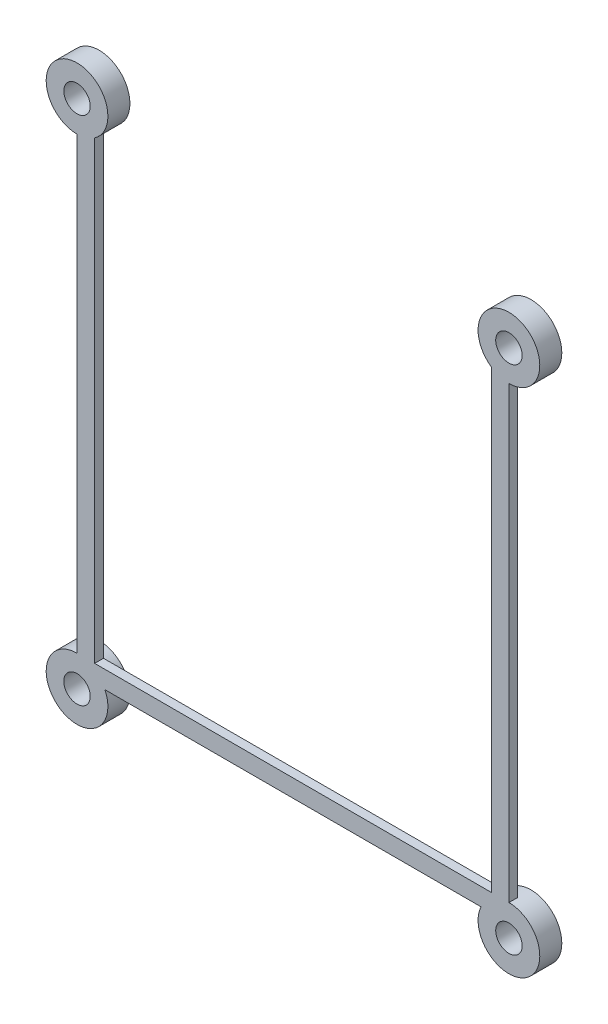
ISO-10303-21;
HEADER;
FILE_DESCRIPTION(('STEP AP214'),'2;1');
FILE_NAME('part.step','',(''),(''),'','','');
FILE_SCHEMA(('AUTOMOTIVE_DESIGN { 1 0 10303 214 1 1 1 1 }'));
ENDSEC;
DATA;
#1=APPLICATION_CONTEXT('core data for automotive mechanical design processes');
#2=APPLICATION_PROTOCOL_DEFINITION('international standard','automotive_design',2000,#1);
#3=PRODUCT_CONTEXT('',#1,'mechanical');
#4=PRODUCT('Part','Part','',(#3));
#5=PRODUCT_RELATED_PRODUCT_CATEGORY('part','',(#4));
#6=PRODUCT_DEFINITION_FORMATION('','',#4);
#7=PRODUCT_DEFINITION_CONTEXT('part definition',#1,'design');
#8=PRODUCT_DEFINITION('design','',#6,#7);
#9=PRODUCT_DEFINITION_SHAPE('','',#8);
#10=(LENGTH_UNIT() NAMED_UNIT(*) SI_UNIT(.MILLI.,.METRE.));
#11=(NAMED_UNIT(*) PLANE_ANGLE_UNIT() SI_UNIT($,.RADIAN.));
#12=(NAMED_UNIT(*) SI_UNIT($,.STERADIAN.) SOLID_ANGLE_UNIT());
#13=UNCERTAINTY_MEASURE_WITH_UNIT(LENGTH_MEASURE(1.E-05),#10,'distance_accuracy_value','');
#14=(GEOMETRIC_REPRESENTATION_CONTEXT(3) GLOBAL_UNCERTAINTY_ASSIGNED_CONTEXT((#13)) GLOBAL_UNIT_ASSIGNED_CONTEXT((#10,
#11,#12)) REPRESENTATION_CONTEXT('',''));
#15=CARTESIAN_POINT('',(0.,0.,0.));
#16=DIRECTION('',(0.,0.,1.));
#17=DIRECTION('',(1.,0.,0.));
#18=AXIS2_PLACEMENT_3D('',#15,#16,#17);
#19=CARTESIAN_POINT('',(-24.5,-27.5,1.5));
#20=DIRECTION('',(0.,-1.,0.));
#21=DIRECTION('',(1.,0.,0.));
#22=AXIS2_PLACEMENT_3D('',#19,#20,#21);
#23=PLANE('',#22);
#24=DIRECTION('',(1.,0.,0.));
#25=VECTOR('',#24,1.);
#26=CARTESIAN_POINT('',(-24.5,-27.5,1.5));
#27=LINE('',#26,#25);
#28=CARTESIAN_POINT('',(-21.3377223398316,-27.5,1.5));
#29=VERTEX_POINT('',#28);
#30=CARTESIAN_POINT('',(21.3377223398316,-27.5,1.5));
#31=VERTEX_POINT('',#30);
#32=EDGE_CURVE('E123',#29,#31,#27,.T.);
#33=ORIENTED_EDGE('',*,*,#32,.T.);
#34=DIRECTION('',(0.,0.,-1.));
#35=VECTOR('',#34,1.);
#36=CARTESIAN_POINT('',(21.3377223398316,-27.5,2.5));
#37=LINE('',#36,#35);
#38=CARTESIAN_POINT('',(21.3377223398316,-27.5,2.5));
#39=VERTEX_POINT('',#38);
#40=EDGE_CURVE('E62',#31,#39,#37,.F.);
#41=ORIENTED_EDGE('',*,*,#40,.T.);
#42=DIRECTION('',(1.,0.,0.));
#43=VECTOR('',#42,1.);
#44=CARTESIAN_POINT('',(-24.5,-27.5,2.5));
#45=LINE('',#44,#43);
#46=CARTESIAN_POINT('',(-21.3377223398316,-27.5,2.5));
#47=VERTEX_POINT('',#46);
#48=EDGE_CURVE('E188',#47,#39,#45,.T.);
#49=ORIENTED_EDGE('',*,*,#48,.F.);
#50=DIRECTION('',(0.,0.,-1.));
#51=VECTOR('',#50,1.);
#52=CARTESIAN_POINT('',(-21.3377223398316,-27.5,2.5));
#53=LINE('',#52,#51);
#54=EDGE_CURVE('E148',#47,#29,#53,.T.);
#55=ORIENTED_EDGE('',*,*,#54,.T.);
#56=EDGE_LOOP('',(#33,#41,#49,#55));
#57=FACE_BOUND('',#56,.T.);
#58=ADVANCED_FACE('F39',(#57),#23,.T.);
#59=CARTESIAN_POINT('',(24.5,27.5,1.5));
#60=DIRECTION('',(1.,0.,0.));
#61=DIRECTION('',(0.,1.,0.));
#62=AXIS2_PLACEMENT_3D('',#59,#60,#61);
#63=PLANE('',#62);
#64=DIRECTION('',(0.,1.,0.));
#65=VECTOR('',#64,1.);
#66=CARTESIAN_POINT('',(24.5,27.5,2.5));
#67=LINE('',#66,#65);
#68=CARTESIAN_POINT('',(24.5,-25.5,2.5));
#69=VERTEX_POINT('',#68);
#70=CARTESIAN_POINT('',(24.5,25.5,2.5));
#71=VERTEX_POINT('',#70);
#72=EDGE_CURVE('E54',#69,#71,#67,.T.);
#73=ORIENTED_EDGE('',*,*,#72,.F.);
#74=DIRECTION('',(0.,0.,-1.));
#75=VECTOR('',#74,1.);
#76=CARTESIAN_POINT('',(24.5,-25.5,2.5));
#77=LINE('',#76,#75);
#78=CARTESIAN_POINT('',(24.5,-25.5,1.5));
#79=VERTEX_POINT('',#78);
#80=EDGE_CURVE('E125',#69,#79,#77,.T.);
#81=ORIENTED_EDGE('',*,*,#80,.T.);
#82=DIRECTION('',(0.,1.,0.));
#83=VECTOR('',#82,1.);
#84=CARTESIAN_POINT('',(24.5,27.5,1.5));
#85=LINE('',#84,#83);
#86=CARTESIAN_POINT('',(24.5,25.5,1.5));
#87=VERTEX_POINT('',#86);
#88=EDGE_CURVE('E117',#79,#87,#85,.T.);
#89=ORIENTED_EDGE('',*,*,#88,.T.);
#90=DIRECTION('',(0.,0.,-1.));
#91=VECTOR('',#90,1.);
#92=CARTESIAN_POINT('',(24.5,25.5,2.5));
#93=LINE('',#92,#91);
#94=EDGE_CURVE('E165',#87,#71,#93,.F.);
#95=ORIENTED_EDGE('',*,*,#94,.T.);
#96=EDGE_LOOP('',(#73,#81,#89,#95));
#97=FACE_BOUND('',#96,.T.);
#98=ADVANCED_FACE('F126',(#97),#63,.T.);
#99=CARTESIAN_POINT('',(-24.5,-27.5,1.5));
#100=DIRECTION('',(-1.,0.,0.));
#101=DIRECTION('',(0.,-1.,0.));
#102=AXIS2_PLACEMENT_3D('',#99,#100,#101);
#103=PLANE('',#102);
#104=DIRECTION('',(0.,-1.,0.));
#105=VECTOR('',#104,1.);
#106=CARTESIAN_POINT('',(-24.5,-27.5,1.5));
#107=LINE('',#106,#105);
#108=CARTESIAN_POINT('',(-24.5,25.5,1.5));
#109=VERTEX_POINT('',#108);
#110=CARTESIAN_POINT('',(-24.5,-25.5,1.5));
#111=VERTEX_POINT('',#110);
#112=EDGE_CURVE('E173',#109,#111,#107,.T.);
#113=ORIENTED_EDGE('',*,*,#112,.T.);
#114=DIRECTION('',(0.,0.,-1.));
#115=VECTOR('',#114,1.);
#116=CARTESIAN_POINT('',(-24.5,-25.5,2.5));
#117=LINE('',#116,#115);
#118=CARTESIAN_POINT('',(-24.5,-25.5,2.5));
#119=VERTEX_POINT('',#118);
#120=EDGE_CURVE('E153',#111,#119,#117,.F.);
#121=ORIENTED_EDGE('',*,*,#120,.T.);
#122=DIRECTION('',(0.,-1.,0.));
#123=VECTOR('',#122,1.);
#124=CARTESIAN_POINT('',(-24.5,-27.5,2.5));
#125=LINE('',#124,#123);
#126=CARTESIAN_POINT('',(-24.5,25.5,2.5));
#127=VERTEX_POINT('',#126);
#128=EDGE_CURVE('E172',#127,#119,#125,.T.);
#129=ORIENTED_EDGE('',*,*,#128,.F.);
#130=DIRECTION('',(0.,0.,-1.));
#131=VECTOR('',#130,1.);
#132=CARTESIAN_POINT('',(-24.5,25.5,2.5));
#133=LINE('',#132,#131);
#134=EDGE_CURVE('E203',#109,#127,#133,.F.);
#135=ORIENTED_EDGE('',*,*,#134,.F.);
#136=EDGE_LOOP('',(#113,#121,#129,#135));
#137=FACE_BOUND('',#136,.T.);
#138=ADVANCED_FACE('F231',(#137),#103,.T.);
#139=CARTESIAN_POINT('',(22.5,27.5,1.5));
#140=DIRECTION('',(-1.,0.,0.));
#141=DIRECTION('',(0.,-1.,0.));
#142=AXIS2_PLACEMENT_3D('',#139,#140,#141);
#143=PLANE('',#142);
#144=DIRECTION('',(0.,-1.,0.));
#145=VECTOR('',#144,1.);
#146=CARTESIAN_POINT('',(22.5,27.5,2.5));
#147=LINE('',#146,#145);
#148=CARTESIAN_POINT('',(22.5,26.127718676731,2.5));
#149=VERTEX_POINT('',#148);
#150=CARTESIAN_POINT('',(22.5,-25.5,2.5));
#151=VERTEX_POINT('',#150);
#152=EDGE_CURVE('E191',#149,#151,#147,.T.);
#153=ORIENTED_EDGE('',*,*,#152,.F.);
#154=DIRECTION('',(0.,0.,-1.));
#155=VECTOR('',#154,1.);
#156=CARTESIAN_POINT('',(22.5,26.127718676731,2.5));
#157=LINE('',#156,#155);
#158=CARTESIAN_POINT('',(22.5,26.127718676731,1.5));
#159=VERTEX_POINT('',#158);
#160=EDGE_CURVE('E169',#149,#159,#157,.T.);
#161=ORIENTED_EDGE('',*,*,#160,.T.);
#162=DIRECTION('',(0.,-1.,0.));
#163=VECTOR('',#162,1.);
#164=CARTESIAN_POINT('',(22.5,27.5,1.5));
#165=LINE('',#164,#163);
#166=CARTESIAN_POINT('',(22.5,-25.5,1.5));
#167=VERTEX_POINT('',#166);
#168=EDGE_CURVE('E122',#159,#167,#165,.T.);
#169=ORIENTED_EDGE('',*,*,#168,.T.);
#170=DIRECTION('',(0.,0.,1.));
#171=VECTOR('',#170,1.);
#172=CARTESIAN_POINT('',(22.5,-25.5,1.5));
#173=LINE('',#172,#171);
#174=EDGE_CURVE('E185',#167,#151,#173,.T.);
#175=ORIENTED_EDGE('',*,*,#174,.T.);
#176=EDGE_LOOP('',(#153,#161,#169,#175));
#177=FACE_BOUND('',#176,.T.);
#178=ADVANCED_FACE('F249',(#177),#143,.T.);
#179=CARTESIAN_POINT('',(-24.5,29.,2.5));
#180=DIRECTION('',(0.,0.,1.));
#181=DIRECTION('',(1.,0.,0.));
#182=AXIS2_PLACEMENT_3D('',#179,#180,#181);
#183=PLANE('',#182);
#184=CARTESIAN_POINT('',(24.5,-29.,2.5));
#185=DIRECTION('',(0.,0.,1.));
#186=DIRECTION('',(1.,0.,0.));
#187=AXIS2_PLACEMENT_3D('',#184,#185,#186);
#188=CIRCLE('',#187,1.49999999999998);
#189=CARTESIAN_POINT('',(26.,-29.,2.5));
#190=VERTEX_POINT('',#189);
#191=EDGE_CURVE('E258',#190,#190,#188,.T.);
#192=ORIENTED_EDGE('',*,*,#191,.F.);
#193=EDGE_LOOP('',(#192));
#194=FACE_BOUND('',#193,.T.);
#195=CARTESIAN_POINT('',(-24.5,29.,2.5));
#196=DIRECTION('',(0.,0.,1.));
#197=DIRECTION('',(1.,0.,0.));
#198=AXIS2_PLACEMENT_3D('',#195,#196,#197);
#199=CIRCLE('',#198,1.5);
#200=CARTESIAN_POINT('',(-23.,29.,2.5));
#201=VERTEX_POINT('',#200);
#202=EDGE_CURVE('E207',#201,#201,#199,.T.);
#203=ORIENTED_EDGE('',*,*,#202,.F.);
#204=EDGE_LOOP('',(#203));
#205=FACE_BOUND('',#204,.T.);
#206=ORIENTED_EDGE('',*,*,#48,.T.);
#207=CARTESIAN_POINT('',(24.5,-29.,2.5));
#208=DIRECTION('',(0.,0.,1.));
#209=DIRECTION('',(1.,0.,0.));
#210=AXIS2_PLACEMENT_3D('',#207,#208,#209);
#211=CIRCLE('',#210,3.5);
#212=EDGE_CURVE('E134',#39,#69,#211,.T.);
#213=ORIENTED_EDGE('',*,*,#212,.T.);
#214=ORIENTED_EDGE('',*,*,#72,.T.);
#215=CARTESIAN_POINT('',(24.5,29.,2.5));
#216=DIRECTION('',(0.,0.,1.));
#217=DIRECTION('',(1.,0.,0.));
#218=AXIS2_PLACEMENT_3D('',#215,#216,#217);
#219=CIRCLE('',#218,3.5);
#220=EDGE_CURVE('E155',#71,#149,#219,.T.);
#221=ORIENTED_EDGE('',*,*,#220,.T.);
#222=ORIENTED_EDGE('',*,*,#152,.T.);
#223=DIRECTION('',(-1.,0.,0.));
#224=VECTOR('',#223,1.);
#225=CARTESIAN_POINT('',(22.5,-25.5,2.5));
#226=LINE('',#225,#224);
#227=CARTESIAN_POINT('',(-22.5,-25.5,2.5));
#228=VERTEX_POINT('',#227);
#229=EDGE_CURVE('E193',#151,#228,#226,.T.);
#230=ORIENTED_EDGE('',*,*,#229,.T.);
#231=DIRECTION('',(0.,1.,0.));
#232=VECTOR('',#231,1.);
#233=CARTESIAN_POINT('',(-22.5,-25.5,2.5));
#234=LINE('',#233,#232);
#235=CARTESIAN_POINT('',(-22.5,26.127718676731,2.5));
#236=VERTEX_POINT('',#235);
#237=EDGE_CURVE('E176',#228,#236,#234,.T.);
#238=ORIENTED_EDGE('',*,*,#237,.T.);
#239=CARTESIAN_POINT('',(-24.5,29.,2.5));
#240=DIRECTION('',(0.,0.,1.));
#241=DIRECTION('',(1.,0.,0.));
#242=AXIS2_PLACEMENT_3D('',#239,#240,#241);
#243=CIRCLE('',#242,3.5);
#244=EDGE_CURVE('E213',#236,#127,#243,.T.);
#245=ORIENTED_EDGE('',*,*,#244,.T.);
#246=ORIENTED_EDGE('',*,*,#128,.T.);
#247=CARTESIAN_POINT('',(-24.5,-29.,2.5));
#248=DIRECTION('',(0.,0.,1.));
#249=DIRECTION('',(1.,0.,0.));
#250=AXIS2_PLACEMENT_3D('',#247,#248,#249);
#251=CIRCLE('',#250,3.5);
#252=EDGE_CURVE('E135',#119,#47,#251,.T.);
#253=ORIENTED_EDGE('',*,*,#252,.T.);
#254=EDGE_LOOP('',(#206,#213,#214,#221,#222,#230,#238,#245,#246,#253));
#255=FACE_BOUND('',#254,.T.);
#256=CARTESIAN_POINT('',(24.5,29.,2.5));
#257=DIRECTION('',(0.,0.,1.));
#258=DIRECTION('',(1.,0.,0.));
#259=AXIS2_PLACEMENT_3D('',#256,#257,#258);
#260=CIRCLE('',#259,1.49999999999999);
#261=CARTESIAN_POINT('',(26.,29.,2.5));
#262=VERTEX_POINT('',#261);
#263=EDGE_CURVE('E159',#262,#262,#260,.T.);
#264=ORIENTED_EDGE('',*,*,#263,.F.);
#265=EDGE_LOOP('',(#264));
#266=FACE_BOUND('',#265,.T.);
#267=CARTESIAN_POINT('',(-24.5,-29.,2.5));
#268=DIRECTION('',(0.,0.,1.));
#269=DIRECTION('',(1.,0.,0.));
#270=AXIS2_PLACEMENT_3D('',#267,#268,#269);
#271=CIRCLE('',#270,1.5);
#272=CARTESIAN_POINT('',(-23.,-29.,2.5));
#273=VERTEX_POINT('',#272);
#274=EDGE_CURVE('E143',#273,#273,#271,.T.);
#275=ORIENTED_EDGE('',*,*,#274,.F.);
#276=EDGE_LOOP('',(#275));
#277=FACE_BOUND('',#276,.T.);
#278=ADVANCED_FACE('F236',(#194,#205,#255,#266,#277),#183,.T.);
#279=CARTESIAN_POINT('',(-24.5,29.,0.));
#280=DIRECTION('',(0.,0.,1.));
#281=DIRECTION('',(1.,0.,0.));
#282=AXIS2_PLACEMENT_3D('',#279,#280,#281);
#283=PLANE('',#282);
#284=CARTESIAN_POINT('',(-24.5,29.,0.));
#285=DIRECTION('',(0.,0.,1.));
#286=DIRECTION('',(1.,0.,0.));
#287=AXIS2_PLACEMENT_3D('',#284,#285,#286);
#288=CIRCLE('',#287,3.5);
#289=CARTESIAN_POINT('',(-21.,29.,0.));
#290=VERTEX_POINT('',#289);
#291=EDGE_CURVE('E210',#290,#290,#288,.T.);
#292=ORIENTED_EDGE('',*,*,#291,.F.);
#293=EDGE_LOOP('',(#292));
#294=FACE_BOUND('',#293,.T.);
#295=CARTESIAN_POINT('',(-24.5,29.,0.));
#296=DIRECTION('',(0.,0.,1.));
#297=DIRECTION('',(1.,0.,0.));
#298=AXIS2_PLACEMENT_3D('',#295,#296,#297);
#299=CIRCLE('',#298,1.5);
#300=CARTESIAN_POINT('',(-23.,29.,0.));
#301=VERTEX_POINT('',#300);
#302=EDGE_CURVE('E206',#301,#301,#299,.T.);
#303=ORIENTED_EDGE('',*,*,#302,.T.);
#304=EDGE_LOOP('',(#303));
#305=FACE_BOUND('',#304,.T.);
#306=ADVANCED_FACE('F270',(#294,#305),#283,.F.);
#307=CARTESIAN_POINT('',(-24.5,29.,2.5));
#308=DIRECTION('',(0.,0.,-1.));
#309=DIRECTION('',(-1.,0.,0.));
#310=AXIS2_PLACEMENT_3D('',#307,#308,#309);
#311=CYLINDRICAL_SURFACE('',#310,3.5);
#312=ORIENTED_EDGE('',*,*,#244,.F.);
#313=DIRECTION('',(0.,0.,-1.));
#314=VECTOR('',#313,1.);
#315=CARTESIAN_POINT('',(-22.5,26.127718676731,2.5));
#316=LINE('',#315,#314);
#317=CARTESIAN_POINT('',(-22.5,26.127718676731,1.5));
#318=VERTEX_POINT('',#317);
#319=EDGE_CURVE('E216',#236,#318,#316,.T.);
#320=ORIENTED_EDGE('',*,*,#319,.T.);
#321=CARTESIAN_POINT('',(-24.5,29.,1.5));
#322=DIRECTION('',(0.,0.,1.));
#323=DIRECTION('',(1.,0.,0.));
#324=AXIS2_PLACEMENT_3D('',#321,#322,#323);
#325=CIRCLE('',#324,3.5);
#326=EDGE_CURVE('E199',#109,#318,#325,.T.);
#327=ORIENTED_EDGE('',*,*,#326,.F.);
#328=ORIENTED_EDGE('',*,*,#134,.T.);
#329=EDGE_LOOP('',(#312,#320,#327,#328));
#330=FACE_BOUND('',#329,.T.);
#331=ORIENTED_EDGE('',*,*,#291,.T.);
#332=EDGE_LOOP('',(#331));
#333=FACE_BOUND('',#332,.T.);
#334=ADVANCED_FACE('F41',(#330,#333),#311,.T.);
#335=CARTESIAN_POINT('',(-24.5,29.,2.5));
#336=DIRECTION('',(0.,0.,-1.));
#337=DIRECTION('',(-1.,0.,0.));
#338=AXIS2_PLACEMENT_3D('',#335,#336,#337);
#339=CYLINDRICAL_SURFACE('',#338,1.5);
#340=ORIENTED_EDGE('',*,*,#202,.T.);
#341=EDGE_LOOP('',(#340));
#342=FACE_BOUND('',#341,.T.);
#343=ORIENTED_EDGE('',*,*,#302,.F.);
#344=EDGE_LOOP('',(#343));
#345=FACE_BOUND('',#344,.T.);
#346=ADVANCED_FACE('F274',(#342,#345),#339,.F.);
#347=CARTESIAN_POINT('',(-22.5,-25.5,1.5));
#348=DIRECTION('',(1.,0.,0.));
#349=DIRECTION('',(0.,0.,-1.));
#350=AXIS2_PLACEMENT_3D('',#347,#348,#349);
#351=PLANE('',#350);
#352=ORIENTED_EDGE('',*,*,#319,.F.);
#353=ORIENTED_EDGE('',*,*,#237,.F.);
#354=DIRECTION('',(0.,0.,1.));
#355=VECTOR('',#354,1.);
#356=CARTESIAN_POINT('',(-22.5,-25.5,1.5));
#357=LINE('',#356,#355);
#358=CARTESIAN_POINT('',(-22.5,-25.5,1.5));
#359=VERTEX_POINT('',#358);
#360=EDGE_CURVE('E197',#359,#228,#357,.T.);
#361=ORIENTED_EDGE('',*,*,#360,.F.);
#362=DIRECTION('',(0.,1.,0.));
#363=VECTOR('',#362,1.);
#364=CARTESIAN_POINT('',(-22.5,-25.5,1.5));
#365=LINE('',#364,#363);
#366=EDGE_CURVE('E182',#359,#318,#365,.T.);
#367=ORIENTED_EDGE('',*,*,#366,.T.);
#368=EDGE_LOOP('',(#352,#353,#361,#367));
#369=FACE_BOUND('',#368,.T.);
#370=ADVANCED_FACE('F242',(#369),#351,.T.);
#371=CARTESIAN_POINT('',(22.5,-25.5,1.5));
#372=DIRECTION('',(0.,1.,0.));
#373=DIRECTION('',(-1.,0.,0.));
#374=AXIS2_PLACEMENT_3D('',#371,#372,#373);
#375=PLANE('',#374);
#376=ORIENTED_EDGE('',*,*,#229,.F.);
#377=ORIENTED_EDGE('',*,*,#174,.F.);
#378=DIRECTION('',(-1.,0.,0.));
#379=VECTOR('',#378,1.);
#380=CARTESIAN_POINT('',(22.5,-25.5,1.5));
#381=LINE('',#380,#379);
#382=EDGE_CURVE('E179',#167,#359,#381,.T.);
#383=ORIENTED_EDGE('',*,*,#382,.T.);
#384=ORIENTED_EDGE('',*,*,#360,.T.);
#385=EDGE_LOOP('',(#376,#377,#383,#384));
#386=FACE_BOUND('',#385,.T.);
#387=ADVANCED_FACE('F247',(#386),#375,.T.);
#388=CARTESIAN_POINT('',(0.,0.,1.5));
#389=DIRECTION('',(0.,0.,1.));
#390=DIRECTION('',(1.,0.,0.));
#391=AXIS2_PLACEMENT_3D('',#388,#389,#390);
#392=PLANE('',#391);
#393=CARTESIAN_POINT('',(24.5,-29.,1.5));
#394=DIRECTION('',(0.,0.,1.));
#395=DIRECTION('',(1.,0.,0.));
#396=AXIS2_PLACEMENT_3D('',#393,#394,#395);
#397=CIRCLE('',#396,3.5);
#398=EDGE_CURVE('E11',#31,#79,#397,.F.);
#399=ORIENTED_EDGE('',*,*,#398,.F.);
#400=ORIENTED_EDGE('',*,*,#32,.F.);
#401=CARTESIAN_POINT('',(-24.5,-29.,1.5));
#402=DIRECTION('',(0.,0.,1.));
#403=DIRECTION('',(1.,0.,0.));
#404=AXIS2_PLACEMENT_3D('',#401,#402,#403);
#405=CIRCLE('',#404,3.5);
#406=EDGE_CURVE('E47',#111,#29,#405,.F.);
#407=ORIENTED_EDGE('',*,*,#406,.F.);
#408=ORIENTED_EDGE('',*,*,#112,.F.);
#409=ORIENTED_EDGE('',*,*,#326,.T.);
#410=ORIENTED_EDGE('',*,*,#366,.F.);
#411=ORIENTED_EDGE('',*,*,#382,.F.);
#412=ORIENTED_EDGE('',*,*,#168,.F.);
#413=CARTESIAN_POINT('',(24.5,29.,1.5));
#414=DIRECTION('',(0.,0.,1.));
#415=DIRECTION('',(1.,0.,0.));
#416=AXIS2_PLACEMENT_3D('',#413,#414,#415);
#417=CIRCLE('',#416,3.5);
#418=EDGE_CURVE('E120',#87,#159,#417,.F.);
#419=ORIENTED_EDGE('',*,*,#418,.F.);
#420=ORIENTED_EDGE('',*,*,#88,.F.);
#421=EDGE_LOOP('',(#399,#400,#407,#408,#409,#410,#411,#412,#419,#420));
#422=FACE_BOUND('',#421,.T.);
#423=ADVANCED_FACE('F118',(#422),#392,.F.);
#424=CARTESIAN_POINT('',(24.5,29.,0.));
#425=DIRECTION('',(0.,0.,1.));
#426=DIRECTION('',(1.,0.,0.));
#427=AXIS2_PLACEMENT_3D('',#424,#425,#426);
#428=PLANE('',#427);
#429=CARTESIAN_POINT('',(24.5,29.,0.));
#430=DIRECTION('',(0.,0.,1.));
#431=DIRECTION('',(1.,0.,0.));
#432=AXIS2_PLACEMENT_3D('',#429,#430,#431);
#433=CIRCLE('',#432,3.5);
#434=CARTESIAN_POINT('',(28.,29.,0.));
#435=VERTEX_POINT('',#434);
#436=EDGE_CURVE('E156',#435,#435,#433,.T.);
#437=ORIENTED_EDGE('',*,*,#436,.F.);
#438=EDGE_LOOP('',(#437));
#439=FACE_BOUND('',#438,.T.);
#440=CARTESIAN_POINT('',(24.5,29.,0.));
#441=DIRECTION('',(0.,0.,1.));
#442=DIRECTION('',(1.,0.,0.));
#443=AXIS2_PLACEMENT_3D('',#440,#441,#442);
#444=CIRCLE('',#443,1.49999999999999);
#445=CARTESIAN_POINT('',(26.,29.,0.));
#446=VERTEX_POINT('',#445);
#447=EDGE_CURVE('E162',#446,#446,#444,.T.);
#448=ORIENTED_EDGE('',*,*,#447,.T.);
#449=EDGE_LOOP('',(#448));
#450=FACE_BOUND('',#449,.T.);
#451=ADVANCED_FACE('F307',(#439,#450),#428,.F.);
#452=CARTESIAN_POINT('',(24.5,29.,2.5));
#453=DIRECTION('',(0.,0.,-1.));
#454=DIRECTION('',(-1.,0.,0.));
#455=AXIS2_PLACEMENT_3D('',#452,#453,#454);
#456=CYLINDRICAL_SURFACE('',#455,3.5);
#457=ORIENTED_EDGE('',*,*,#160,.F.);
#458=ORIENTED_EDGE('',*,*,#220,.F.);
#459=ORIENTED_EDGE('',*,*,#94,.F.);
#460=ORIENTED_EDGE('',*,*,#418,.T.);
#461=EDGE_LOOP('',(#457,#458,#459,#460));
#462=FACE_BOUND('',#461,.T.);
#463=ORIENTED_EDGE('',*,*,#436,.T.);
#464=EDGE_LOOP('',(#463));
#465=FACE_BOUND('',#464,.T.);
#466=ADVANCED_FACE('F253',(#462,#465),#456,.T.);
#467=CARTESIAN_POINT('',(24.5,29.,2.5));
#468=DIRECTION('',(0.,0.,-1.));
#469=DIRECTION('',(-1.,0.,0.));
#470=AXIS2_PLACEMENT_3D('',#467,#468,#469);
#471=CYLINDRICAL_SURFACE('',#470,1.49999999999999);
#472=ORIENTED_EDGE('',*,*,#263,.T.);
#473=EDGE_LOOP('',(#472));
#474=FACE_BOUND('',#473,.T.);
#475=ORIENTED_EDGE('',*,*,#447,.F.);
#476=EDGE_LOOP('',(#475));
#477=FACE_BOUND('',#476,.T.);
#478=ADVANCED_FACE('F308',(#474,#477),#471,.F.);
#479=CARTESIAN_POINT('',(-24.5,-29.,0.));
#480=DIRECTION('',(0.,0.,1.));
#481=DIRECTION('',(1.,0.,0.));
#482=AXIS2_PLACEMENT_3D('',#479,#480,#481);
#483=PLANE('',#482);
#484=CARTESIAN_POINT('',(-24.5,-29.,0.));
#485=DIRECTION('',(0.,0.,1.));
#486=DIRECTION('',(1.,0.,0.));
#487=AXIS2_PLACEMENT_3D('',#484,#485,#486);
#488=CIRCLE('',#487,3.5);
#489=CARTESIAN_POINT('',(-21.,-29.,0.));
#490=VERTEX_POINT('',#489);
#491=EDGE_CURVE('E138',#490,#490,#488,.T.);
#492=ORIENTED_EDGE('',*,*,#491,.F.);
#493=EDGE_LOOP('',(#492));
#494=FACE_BOUND('',#493,.T.);
#495=CARTESIAN_POINT('',(-24.5,-29.,0.));
#496=DIRECTION('',(0.,0.,1.));
#497=DIRECTION('',(1.,0.,0.));
#498=AXIS2_PLACEMENT_3D('',#495,#496,#497);
#499=CIRCLE('',#498,1.5);
#500=CARTESIAN_POINT('',(-23.,-29.,0.));
#501=VERTEX_POINT('',#500);
#502=EDGE_CURVE('E145',#501,#501,#499,.T.);
#503=ORIENTED_EDGE('',*,*,#502,.T.);
#504=EDGE_LOOP('',(#503));
#505=FACE_BOUND('',#504,.T.);
#506=ADVANCED_FACE('F311',(#494,#505),#483,.F.);
#507=CARTESIAN_POINT('',(-24.5,-29.,2.5));
#508=DIRECTION('',(0.,0.,-1.));
#509=DIRECTION('',(-1.,0.,0.));
#510=AXIS2_PLACEMENT_3D('',#507,#508,#509);
#511=CYLINDRICAL_SURFACE('',#510,3.5);
#512=ORIENTED_EDGE('',*,*,#120,.F.);
#513=ORIENTED_EDGE('',*,*,#406,.T.);
#514=ORIENTED_EDGE('',*,*,#54,.F.);
#515=ORIENTED_EDGE('',*,*,#252,.F.);
#516=EDGE_LOOP('',(#512,#513,#514,#515));
#517=FACE_BOUND('',#516,.T.);
#518=ORIENTED_EDGE('',*,*,#491,.T.);
#519=EDGE_LOOP('',(#518));
#520=FACE_BOUND('',#519,.T.);
#521=ADVANCED_FACE('F225',(#517,#520),#511,.T.);
#522=CARTESIAN_POINT('',(-24.5,-29.,2.5));
#523=DIRECTION('',(0.,0.,-1.));
#524=DIRECTION('',(-1.,0.,0.));
#525=AXIS2_PLACEMENT_3D('',#522,#523,#524);
#526=CYLINDRICAL_SURFACE('',#525,1.5);
#527=ORIENTED_EDGE('',*,*,#274,.T.);
#528=EDGE_LOOP('',(#527));
#529=FACE_BOUND('',#528,.T.);
#530=ORIENTED_EDGE('',*,*,#502,.F.);
#531=EDGE_LOOP('',(#530));
#532=FACE_BOUND('',#531,.T.);
#533=ADVANCED_FACE('F318',(#529,#532),#526,.F.);
#534=CARTESIAN_POINT('',(24.5,-29.,0.));
#535=DIRECTION('',(0.,0.,1.));
#536=DIRECTION('',(1.,0.,0.));
#537=AXIS2_PLACEMENT_3D('',#534,#535,#536);
#538=PLANE('',#537);
#539=CARTESIAN_POINT('',(24.5,-29.,0.));
#540=DIRECTION('',(0.,0.,1.));
#541=DIRECTION('',(1.,0.,0.));
#542=AXIS2_PLACEMENT_3D('',#539,#540,#541);
#543=CIRCLE('',#542,3.5);
#544=CARTESIAN_POINT('',(28.,-29.,0.));
#545=VERTEX_POINT('',#544);
#546=EDGE_CURVE('E255',#545,#545,#543,.T.);
#547=ORIENTED_EDGE('',*,*,#546,.F.);
#548=EDGE_LOOP('',(#547));
#549=FACE_BOUND('',#548,.T.);
#550=CARTESIAN_POINT('',(24.5,-29.,0.));
#551=DIRECTION('',(0.,0.,1.));
#552=DIRECTION('',(1.,0.,0.));
#553=AXIS2_PLACEMENT_3D('',#550,#551,#552);
#554=CIRCLE('',#553,1.49999999999998);
#555=CARTESIAN_POINT('',(26.,-29.,0.));
#556=VERTEX_POINT('',#555);
#557=EDGE_CURVE('E130',#556,#556,#554,.T.);
#558=ORIENTED_EDGE('',*,*,#557,.T.);
#559=EDGE_LOOP('',(#558));
#560=FACE_BOUND('',#559,.T.);
#561=ADVANCED_FACE('F321',(#549,#560),#538,.F.);
#562=CARTESIAN_POINT('',(24.5,-29.,2.5));
#563=DIRECTION('',(0.,0.,-1.));
#564=DIRECTION('',(-1.,0.,0.));
#565=AXIS2_PLACEMENT_3D('',#562,#563,#564);
#566=CYLINDRICAL_SURFACE('',#565,3.5);
#567=ORIENTED_EDGE('',*,*,#40,.F.);
#568=ORIENTED_EDGE('',*,*,#398,.T.);
#569=ORIENTED_EDGE('',*,*,#80,.F.);
#570=ORIENTED_EDGE('',*,*,#212,.F.);
#571=EDGE_LOOP('',(#567,#568,#569,#570));
#572=FACE_BOUND('',#571,.T.);
#573=ORIENTED_EDGE('',*,*,#546,.T.);
#574=EDGE_LOOP('',(#573));
#575=FACE_BOUND('',#574,.T.);
#576=ADVANCED_FACE('F132',(#572,#575),#566,.T.);
#577=CARTESIAN_POINT('',(24.5,-29.,2.5));
#578=DIRECTION('',(0.,0.,-1.));
#579=DIRECTION('',(-1.,0.,0.));
#580=AXIS2_PLACEMENT_3D('',#577,#578,#579);
#581=CYLINDRICAL_SURFACE('',#580,1.49999999999998);
#582=ORIENTED_EDGE('',*,*,#191,.T.);
#583=EDGE_LOOP('',(#582));
#584=FACE_BOUND('',#583,.T.);
#585=ORIENTED_EDGE('',*,*,#557,.F.);
#586=EDGE_LOOP('',(#585));
#587=FACE_BOUND('',#586,.T.);
#588=ADVANCED_FACE('F265',(#584,#587),#581,.F.);
#589=CLOSED_SHELL('',(#58,#98,#138,#178,#278,#306,#334,#346,#370,#387,#423,#451,#466,#478,#506,
#521,#533,#561,#576,#588));
#590=MANIFOLD_SOLID_BREP('B2',#589);
#591=ADVANCED_BREP_SHAPE_REPRESENTATION('',(#18,#590),#14);
#592=SHAPE_DEFINITION_REPRESENTATION(#9,#591);
ENDSEC;
END-ISO-10303-21;
